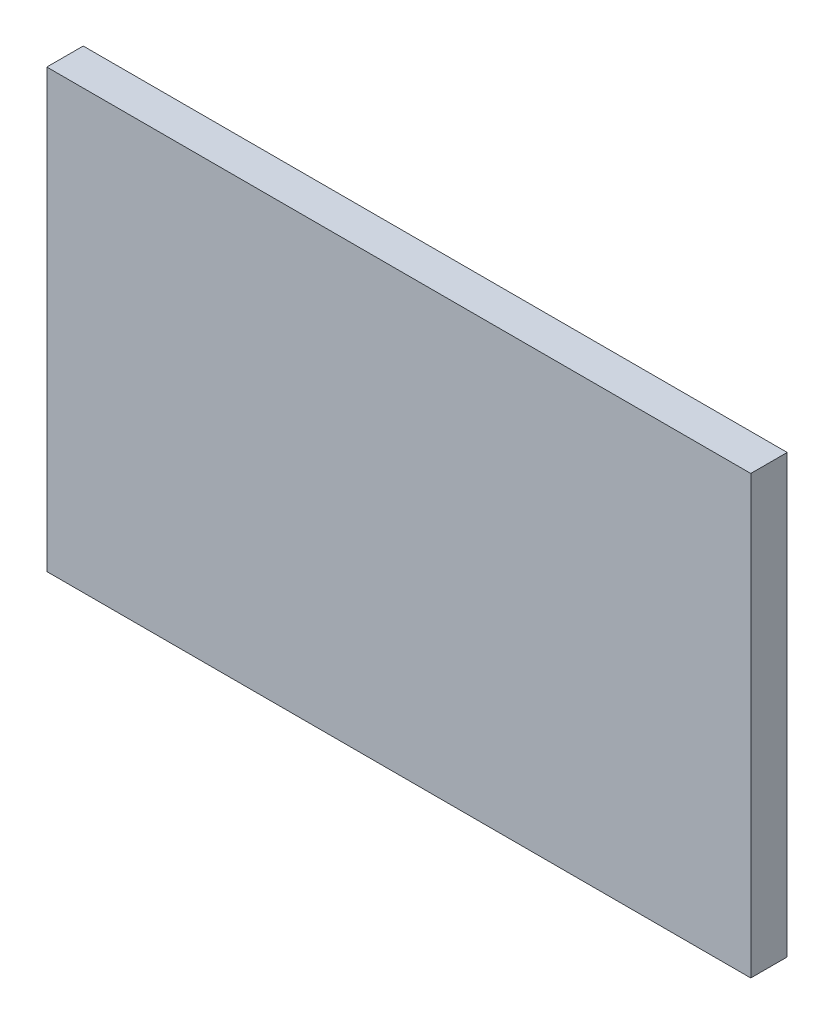
ISO-10303-21;
HEADER;
FILE_DESCRIPTION(('STEP AP214'),'2;1');
FILE_NAME('part.step','',(''),(''),'','','');
FILE_SCHEMA(('AUTOMOTIVE_DESIGN { 1 0 10303 214 1 1 1 1 }'));
ENDSEC;
DATA;
#1=APPLICATION_CONTEXT('core data for automotive mechanical design processes');
#2=APPLICATION_PROTOCOL_DEFINITION('international standard','automotive_design',2000,#1);
#3=PRODUCT_CONTEXT('',#1,'mechanical');
#4=PRODUCT('Part','Part','',(#3));
#5=PRODUCT_RELATED_PRODUCT_CATEGORY('part','',(#4));
#6=PRODUCT_DEFINITION_FORMATION('','',#4);
#7=PRODUCT_DEFINITION_CONTEXT('part definition',#1,'design');
#8=PRODUCT_DEFINITION('design','',#6,#7);
#9=PRODUCT_DEFINITION_SHAPE('','',#8);
#10=(LENGTH_UNIT() NAMED_UNIT(*) SI_UNIT(.MILLI.,.METRE.));
#11=(NAMED_UNIT(*) PLANE_ANGLE_UNIT() SI_UNIT($,.RADIAN.));
#12=(NAMED_UNIT(*) SI_UNIT($,.STERADIAN.) SOLID_ANGLE_UNIT());
#13=UNCERTAINTY_MEASURE_WITH_UNIT(LENGTH_MEASURE(1.E-05),#10,'distance_accuracy_value','');
#14=(GEOMETRIC_REPRESENTATION_CONTEXT(3) GLOBAL_UNCERTAINTY_ASSIGNED_CONTEXT((#13)) GLOBAL_UNIT_ASSIGNED_CONTEXT((#10,
#11,#12)) REPRESENTATION_CONTEXT('',''));
#15=CARTESIAN_POINT('',(0.,0.,0.));
#16=DIRECTION('',(0.,0.,1.));
#17=DIRECTION('',(1.,0.,0.));
#18=AXIS2_PLACEMENT_3D('',#15,#16,#17);
#19=CARTESIAN_POINT('',(-7.,9.,-0.25));
#20=DIRECTION('',(1.,0.,0.));
#21=DIRECTION('',(0.,0.,-1.));
#22=AXIS2_PLACEMENT_3D('',#19,#20,#21);
#23=PLANE('',#22);
#24=DIRECTION('',(0.,0.,1.));
#25=VECTOR('',#24,1.);
#26=CARTESIAN_POINT('',(-7.,0.,-0.25));
#27=LINE('',#26,#25);
#28=CARTESIAN_POINT('',(-7.,0.,-0.25));
#29=VERTEX_POINT('',#28);
#30=CARTESIAN_POINT('',(-7.,0.,0.5));
#31=VERTEX_POINT('',#30);
#32=EDGE_CURVE('E103',#29,#31,#27,.T.);
#33=ORIENTED_EDGE('',*,*,#32,.T.);
#34=DIRECTION('',(0.,-1.,0.));
#35=VECTOR('',#34,1.);
#36=CARTESIAN_POINT('',(-7.,9.,0.5));
#37=LINE('',#36,#35);
#38=CARTESIAN_POINT('',(-7.,9.,0.5));
#39=VERTEX_POINT('',#38);
#40=EDGE_CURVE('E11',#39,#31,#37,.T.);
#41=ORIENTED_EDGE('',*,*,#40,.F.);
#42=DIRECTION('',(0.,0.,1.));
#43=VECTOR('',#42,1.);
#44=CARTESIAN_POINT('',(-7.,9.,-0.25));
#45=LINE('',#44,#43);
#46=CARTESIAN_POINT('',(-7.,9.,-0.25));
#47=VERTEX_POINT('',#46);
#48=EDGE_CURVE('E91',#47,#39,#45,.T.);
#49=ORIENTED_EDGE('',*,*,#48,.F.);
#50=DIRECTION('',(0.,-1.,0.));
#51=VECTOR('',#50,1.);
#52=CARTESIAN_POINT('',(-7.,9.,-0.25));
#53=LINE('',#52,#51);
#54=EDGE_CURVE('E99',#47,#29,#53,.T.);
#55=ORIENTED_EDGE('',*,*,#54,.T.);
#56=EDGE_LOOP('',(#33,#41,#49,#55));
#57=FACE_BOUND('',#56,.T.);
#58=ADVANCED_FACE('F40',(#57),#23,.F.);
#59=CARTESIAN_POINT('',(-7.,9.,0.5));
#60=DIRECTION('',(0.,0.,-1.));
#61=DIRECTION('',(-1.,0.,0.));
#62=AXIS2_PLACEMENT_3D('',#59,#60,#61);
#63=PLANE('',#62);
#64=DIRECTION('',(1.,0.,0.));
#65=VECTOR('',#64,1.);
#66=CARTESIAN_POINT('',(-7.,0.,0.5));
#67=LINE('',#66,#65);
#68=CARTESIAN_POINT('',(7.5,0.,0.5));
#69=VERTEX_POINT('',#68);
#70=EDGE_CURVE('E95',#31,#69,#67,.T.);
#71=ORIENTED_EDGE('',*,*,#70,.T.);
#72=DIRECTION('',(0.,-1.,0.));
#73=VECTOR('',#72,1.);
#74=CARTESIAN_POINT('',(7.5,9.,0.5));
#75=LINE('',#74,#73);
#76=CARTESIAN_POINT('',(7.5,9.,0.5));
#77=VERTEX_POINT('',#76);
#78=EDGE_CURVE('E48',#77,#69,#75,.T.);
#79=ORIENTED_EDGE('',*,*,#78,.F.);
#80=DIRECTION('',(1.,0.,0.));
#81=VECTOR('',#80,1.);
#82=CARTESIAN_POINT('',(-7.,9.,0.5));
#83=LINE('',#82,#81);
#84=EDGE_CURVE('E86',#39,#77,#83,.T.);
#85=ORIENTED_EDGE('',*,*,#84,.F.);
#86=ORIENTED_EDGE('',*,*,#40,.T.);
#87=EDGE_LOOP('',(#71,#79,#85,#86));
#88=FACE_BOUND('',#87,.T.);
#89=ADVANCED_FACE('F94',(#88),#63,.F.);
#90=CARTESIAN_POINT('',(7.5,9.,-0.25));
#91=DIRECTION('',(-1.,0.,0.));
#92=DIRECTION('',(0.,0.,1.));
#93=AXIS2_PLACEMENT_3D('',#90,#91,#92);
#94=PLANE('',#93);
#95=DIRECTION('',(0.,0.,-1.));
#96=VECTOR('',#95,1.);
#97=CARTESIAN_POINT('',(7.5,0.,-0.25));
#98=LINE('',#97,#96);
#99=CARTESIAN_POINT('',(7.5,0.,-0.25));
#100=VERTEX_POINT('',#99);
#101=EDGE_CURVE('E73',#69,#100,#98,.T.);
#102=ORIENTED_EDGE('',*,*,#101,.T.);
#103=DIRECTION('',(0.,-1.,0.));
#104=VECTOR('',#103,1.);
#105=CARTESIAN_POINT('',(7.5,9.,-0.25));
#106=LINE('',#105,#104);
#107=CARTESIAN_POINT('',(7.5,9.,-0.25));
#108=VERTEX_POINT('',#107);
#109=EDGE_CURVE('E96',#108,#100,#106,.T.);
#110=ORIENTED_EDGE('',*,*,#109,.F.);
#111=DIRECTION('',(0.,0.,-1.));
#112=VECTOR('',#111,1.);
#113=CARTESIAN_POINT('',(7.5,9.,-0.25));
#114=LINE('',#113,#112);
#115=EDGE_CURVE('E89',#77,#108,#114,.T.);
#116=ORIENTED_EDGE('',*,*,#115,.F.);
#117=ORIENTED_EDGE('',*,*,#78,.T.);
#118=EDGE_LOOP('',(#102,#110,#116,#117));
#119=FACE_BOUND('',#118,.T.);
#120=ADVANCED_FACE('F97',(#119),#94,.F.);
#121=CARTESIAN_POINT('',(-7.,9.,-0.25));
#122=DIRECTION('',(0.,0.,1.));
#123=DIRECTION('',(1.,0.,0.));
#124=AXIS2_PLACEMENT_3D('',#121,#122,#123);
#125=PLANE('',#124);
#126=DIRECTION('',(-1.,0.,0.));
#127=VECTOR('',#126,1.);
#128=CARTESIAN_POINT('',(-7.,0.,-0.25));
#129=LINE('',#128,#127);
#130=EDGE_CURVE('E79',#100,#29,#129,.T.);
#131=ORIENTED_EDGE('',*,*,#130,.T.);
#132=ORIENTED_EDGE('',*,*,#54,.F.);
#133=DIRECTION('',(-1.,0.,0.));
#134=VECTOR('',#133,1.);
#135=CARTESIAN_POINT('',(-7.,9.,-0.25));
#136=LINE('',#135,#134);
#137=EDGE_CURVE('E56',#108,#47,#136,.T.);
#138=ORIENTED_EDGE('',*,*,#137,.F.);
#139=ORIENTED_EDGE('',*,*,#109,.T.);
#140=EDGE_LOOP('',(#131,#132,#138,#139));
#141=FACE_BOUND('',#140,.T.);
#142=ADVANCED_FACE('F110',(#141),#125,.F.);
#143=CARTESIAN_POINT('',(0.,9.,0.));
#144=DIRECTION('',(0.,1.,0.));
#145=DIRECTION('',(0.,0.,1.));
#146=AXIS2_PLACEMENT_3D('',#143,#144,#145);
#147=PLANE('',#146);
#148=ORIENTED_EDGE('',*,*,#48,.T.);
#149=ORIENTED_EDGE('',*,*,#84,.T.);
#150=ORIENTED_EDGE('',*,*,#115,.T.);
#151=ORIENTED_EDGE('',*,*,#137,.T.);
#152=EDGE_LOOP('',(#148,#149,#150,#151));
#153=FACE_BOUND('',#152,.T.);
#154=ADVANCED_FACE('F87',(#153),#147,.T.);
#155=CARTESIAN_POINT('',(0.,0.,0.));
#156=DIRECTION('',(0.,1.,0.));
#157=DIRECTION('',(0.,0.,1.));
#158=AXIS2_PLACEMENT_3D('',#155,#156,#157);
#159=PLANE('',#158);
#160=ORIENTED_EDGE('',*,*,#32,.F.);
#161=ORIENTED_EDGE('',*,*,#130,.F.);
#162=ORIENTED_EDGE('',*,*,#101,.F.);
#163=ORIENTED_EDGE('',*,*,#70,.F.);
#164=EDGE_LOOP('',(#160,#161,#162,#163));
#165=FACE_BOUND('',#164,.T.);
#166=ADVANCED_FACE('F113',(#165),#159,.F.);
#167=CLOSED_SHELL('',(#58,#89,#120,#142,#154,#166));
#168=MANIFOLD_SOLID_BREP('B2',#167);
#169=ADVANCED_BREP_SHAPE_REPRESENTATION('',(#18,#168),#14);
#170=SHAPE_DEFINITION_REPRESENTATION(#9,#169);
ENDSEC;
END-ISO-10303-21;
